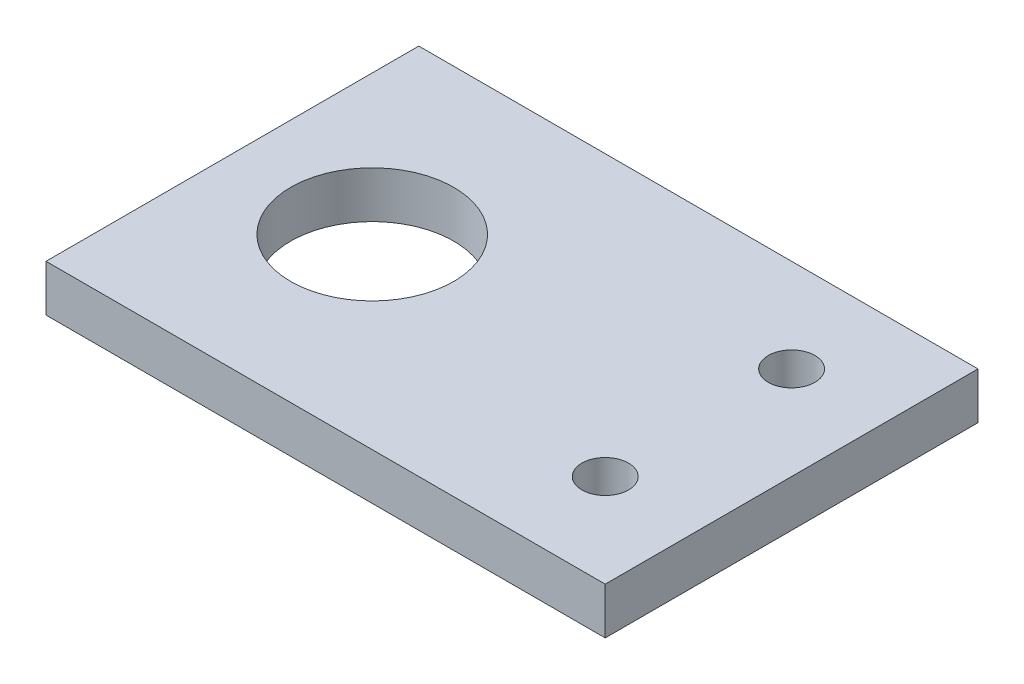
ISO-10303-21;
HEADER;
FILE_DESCRIPTION(('STEP AP214'),'2;1');
FILE_NAME('part.step','',(''),(''),'','','');
FILE_SCHEMA(('AUTOMOTIVE_DESIGN { 1 0 10303 214 1 1 1 1 }'));
ENDSEC;
DATA;
#1=APPLICATION_CONTEXT('core data for automotive mechanical design processes');
#2=APPLICATION_PROTOCOL_DEFINITION('international standard','automotive_design',2000,#1);
#3=PRODUCT_CONTEXT('',#1,'mechanical');
#4=PRODUCT('Part','Part','',(#3));
#5=PRODUCT_RELATED_PRODUCT_CATEGORY('part','',(#4));
#6=PRODUCT_DEFINITION_FORMATION('','',#4);
#7=PRODUCT_DEFINITION_CONTEXT('part definition',#1,'design');
#8=PRODUCT_DEFINITION('design','',#6,#7);
#9=PRODUCT_DEFINITION_SHAPE('','',#8);
#10=(LENGTH_UNIT() NAMED_UNIT(*) SI_UNIT(.MILLI.,.METRE.));
#11=(NAMED_UNIT(*) PLANE_ANGLE_UNIT() SI_UNIT($,.RADIAN.));
#12=(NAMED_UNIT(*) SI_UNIT($,.STERADIAN.) SOLID_ANGLE_UNIT());
#13=UNCERTAINTY_MEASURE_WITH_UNIT(LENGTH_MEASURE(1.E-05),#10,'distance_accuracy_value','');
#14=(GEOMETRIC_REPRESENTATION_CONTEXT(3) GLOBAL_UNCERTAINTY_ASSIGNED_CONTEXT((#13)) GLOBAL_UNIT_ASSIGNED_CONTEXT((#10,
#11,#12)) REPRESENTATION_CONTEXT('',''));
#15=CARTESIAN_POINT('',(0.,0.,0.));
#16=DIRECTION('',(0.,0.,1.));
#17=DIRECTION('',(1.,0.,0.));
#18=AXIS2_PLACEMENT_3D('',#15,#16,#17);
#19=CARTESIAN_POINT('',(-102.768344581676,6.35,-59.1510673494327));
#20=DIRECTION('',(-1.,0.,0.));
#21=DIRECTION('',(0.,0.,1.));
#22=AXIS2_PLACEMENT_3D('',#19,#20,#21);
#23=PLANE('',#22);
#24=DIRECTION('',(0.,0.,-1.));
#25=VECTOR('',#24,1.);
#26=CARTESIAN_POINT('',(-102.768344581676,0.,-59.1510673494327));
#27=LINE('',#26,#25);
#28=CARTESIAN_POINT('',(-102.768344581676,0.,-8.35106734943265));
#29=VERTEX_POINT('',#28);
#30=CARTESIAN_POINT('',(-102.768344581676,0.,-59.1510673494327));
#31=VERTEX_POINT('',#30);
#32=EDGE_CURVE('E96',#29,#31,#27,.T.);
#33=ORIENTED_EDGE('',*,*,#32,.T.);
#34=DIRECTION('',(0.,-1.,0.));
#35=VECTOR('',#34,1.);
#36=CARTESIAN_POINT('',(-102.768344581676,6.35,-59.1510673494327));
#37=LINE('',#36,#35);
#38=CARTESIAN_POINT('',(-102.768344581676,6.35,-59.1510673494327));
#39=VERTEX_POINT('',#38);
#40=EDGE_CURVE('E11',#39,#31,#37,.T.);
#41=ORIENTED_EDGE('',*,*,#40,.F.);
#42=DIRECTION('',(0.,0.,-1.));
#43=VECTOR('',#42,1.);
#44=CARTESIAN_POINT('',(-102.768344581676,6.35,-59.1510673494327));
#45=LINE('',#44,#43);
#46=CARTESIAN_POINT('',(-102.768344581676,6.35,-8.35106734943265));
#47=VERTEX_POINT('',#46);
#48=EDGE_CURVE('E84',#47,#39,#45,.T.);
#49=ORIENTED_EDGE('',*,*,#48,.F.);
#50=DIRECTION('',(0.,-1.,0.));
#51=VECTOR('',#50,1.);
#52=CARTESIAN_POINT('',(-102.768344581676,6.35,-8.35106734943265));
#53=LINE('',#52,#51);
#54=EDGE_CURVE('E92',#47,#29,#53,.T.);
#55=ORIENTED_EDGE('',*,*,#54,.T.);
#56=EDGE_LOOP('',(#33,#41,#49,#55));
#57=FACE_BOUND('',#56,.T.);
#58=ADVANCED_FACE('F33',(#57),#23,.F.);
#59=CARTESIAN_POINT('',(-178.968344581676,6.35,-59.1510673494327));
#60=DIRECTION('',(0.,0.,1.));
#61=DIRECTION('',(1.,0.,0.));
#62=AXIS2_PLACEMENT_3D('',#59,#60,#61);
#63=PLANE('',#62);
#64=DIRECTION('',(-1.,0.,0.));
#65=VECTOR('',#64,1.);
#66=CARTESIAN_POINT('',(-178.968344581676,0.,-59.1510673494327));
#67=LINE('',#66,#65);
#68=CARTESIAN_POINT('',(-178.968344581676,0.,-59.1510673494327));
#69=VERTEX_POINT('',#68);
#70=EDGE_CURVE('E88',#31,#69,#67,.T.);
#71=ORIENTED_EDGE('',*,*,#70,.T.);
#72=DIRECTION('',(0.,-1.,0.));
#73=VECTOR('',#72,1.);
#74=CARTESIAN_POINT('',(-178.968344581676,6.35,-59.1510673494327));
#75=LINE('',#74,#73);
#76=CARTESIAN_POINT('',(-178.968344581676,6.35,-59.1510673494327));
#77=VERTEX_POINT('',#76);
#78=EDGE_CURVE('E41',#77,#69,#75,.T.);
#79=ORIENTED_EDGE('',*,*,#78,.F.);
#80=DIRECTION('',(-1.,0.,0.));
#81=VECTOR('',#80,1.);
#82=CARTESIAN_POINT('',(-178.968344581676,6.35,-59.1510673494327));
#83=LINE('',#82,#81);
#84=EDGE_CURVE('E79',#39,#77,#83,.T.);
#85=ORIENTED_EDGE('',*,*,#84,.F.);
#86=ORIENTED_EDGE('',*,*,#40,.T.);
#87=EDGE_LOOP('',(#71,#79,#85,#86));
#88=FACE_BOUND('',#87,.T.);
#89=ADVANCED_FACE('F87',(#88),#63,.F.);
#90=CARTESIAN_POINT('',(-178.968344581676,6.35,-59.1510673494327));
#91=DIRECTION('',(1.,0.,0.));
#92=DIRECTION('',(0.,0.,-1.));
#93=AXIS2_PLACEMENT_3D('',#90,#91,#92);
#94=PLANE('',#93);
#95=DIRECTION('',(0.,0.,1.));
#96=VECTOR('',#95,1.);
#97=CARTESIAN_POINT('',(-178.968344581676,0.,-59.1510673494327));
#98=LINE('',#97,#96);
#99=CARTESIAN_POINT('',(-178.968344581676,0.,-8.35106734943265));
#100=VERTEX_POINT('',#99);
#101=EDGE_CURVE('E66',#69,#100,#98,.T.);
#102=ORIENTED_EDGE('',*,*,#101,.T.);
#103=DIRECTION('',(0.,-1.,0.));
#104=VECTOR('',#103,1.);
#105=CARTESIAN_POINT('',(-178.968344581676,6.35,-8.35106734943265));
#106=LINE('',#105,#104);
#107=CARTESIAN_POINT('',(-178.968344581676,6.35,-8.35106734943265));
#108=VERTEX_POINT('',#107);
#109=EDGE_CURVE('E89',#108,#100,#106,.T.);
#110=ORIENTED_EDGE('',*,*,#109,.F.);
#111=DIRECTION('',(0.,0.,1.));
#112=VECTOR('',#111,1.);
#113=CARTESIAN_POINT('',(-178.968344581676,6.35,-59.1510673494327));
#114=LINE('',#113,#112);
#115=EDGE_CURVE('E82',#77,#108,#114,.T.);
#116=ORIENTED_EDGE('',*,*,#115,.F.);
#117=ORIENTED_EDGE('',*,*,#78,.T.);
#118=EDGE_LOOP('',(#102,#110,#116,#117));
#119=FACE_BOUND('',#118,.T.);
#120=ADVANCED_FACE('F90',(#119),#94,.F.);
#121=CARTESIAN_POINT('',(-178.968344581676,6.35,-8.35106734943265));
#122=DIRECTION('',(0.,0.,-1.));
#123=DIRECTION('',(-1.,0.,0.));
#124=AXIS2_PLACEMENT_3D('',#121,#122,#123);
#125=PLANE('',#124);
#126=DIRECTION('',(1.,0.,0.));
#127=VECTOR('',#126,1.);
#128=CARTESIAN_POINT('',(-178.968344581676,0.,-8.35106734943265));
#129=LINE('',#128,#127);
#130=EDGE_CURVE('E72',#100,#29,#129,.T.);
#131=ORIENTED_EDGE('',*,*,#130,.T.);
#132=ORIENTED_EDGE('',*,*,#54,.F.);
#133=DIRECTION('',(1.,0.,0.));
#134=VECTOR('',#133,1.);
#135=CARTESIAN_POINT('',(-178.968344581676,6.35,-8.35106734943265));
#136=LINE('',#135,#134);
#137=EDGE_CURVE('E49',#108,#47,#136,.T.);
#138=ORIENTED_EDGE('',*,*,#137,.F.);
#139=ORIENTED_EDGE('',*,*,#109,.T.);
#140=EDGE_LOOP('',(#131,#132,#138,#139));
#141=FACE_BOUND('',#140,.T.);
#142=ADVANCED_FACE('F104',(#141),#125,.F.);
#143=CARTESIAN_POINT('',(0.,6.35,0.));
#144=DIRECTION('',(0.,1.,0.));
#145=DIRECTION('',(0.,0.,1.));
#146=AXIS2_PLACEMENT_3D('',#143,#144,#145);
#147=PLANE('',#146);
#148=CARTESIAN_POINT('',(-115.468344581676,6.35,-21.0510673494327));
#149=DIRECTION('',(0.,1.,0.));
#150=DIRECTION('',(0.,0.,1.));
#151=AXIS2_PLACEMENT_3D('',#148,#149,#150);
#152=CIRCLE('',#151,3.175);
#153=CARTESIAN_POINT('',(-115.468344581676,6.35,-17.8760673494327));
#154=VERTEX_POINT('',#153);
#155=EDGE_CURVE('E122',#154,#154,#152,.T.);
#156=ORIENTED_EDGE('',*,*,#155,.F.);
#157=EDGE_LOOP('',(#156));
#158=FACE_BOUND('',#157,.T.);
#159=CARTESIAN_POINT('',(-115.468344581676,6.35,-46.4510673494326));
#160=DIRECTION('',(0.,1.,0.));
#161=DIRECTION('',(0.,0.,1.));
#162=AXIS2_PLACEMENT_3D('',#159,#160,#161);
#163=CIRCLE('',#162,3.175);
#164=CARTESIAN_POINT('',(-115.468344581676,6.35,-43.2760673494327));
#165=VERTEX_POINT('',#164);
#166=EDGE_CURVE('E116',#165,#165,#163,.T.);
#167=ORIENTED_EDGE('',*,*,#166,.F.);
#168=EDGE_LOOP('',(#167));
#169=FACE_BOUND('',#168,.T.);
#170=CARTESIAN_POINT('',(-159.918344581676,6.35,-33.7510673494327));
#171=DIRECTION('',(0.,1.,0.));
#172=DIRECTION('',(0.,0.,1.));
#173=AXIS2_PLACEMENT_3D('',#170,#171,#172);
#174=CIRCLE('',#173,11.1125);
#175=CARTESIAN_POINT('',(-159.918344581676,6.35,-22.6385673494326));
#176=VERTEX_POINT('',#175);
#177=EDGE_CURVE('E110',#176,#176,#174,.T.);
#178=ORIENTED_EDGE('',*,*,#177,.F.);
#179=EDGE_LOOP('',(#178));
#180=FACE_BOUND('',#179,.T.);
#181=ORIENTED_EDGE('',*,*,#48,.T.);
#182=ORIENTED_EDGE('',*,*,#84,.T.);
#183=ORIENTED_EDGE('',*,*,#115,.T.);
#184=ORIENTED_EDGE('',*,*,#137,.T.);
#185=EDGE_LOOP('',(#181,#182,#183,#184));
#186=FACE_BOUND('',#185,.T.);
#187=ADVANCED_FACE('F80',(#158,#169,#180,#186),#147,.T.);
#188=CARTESIAN_POINT('',(0.,0.,0.));
#189=DIRECTION('',(0.,1.,0.));
#190=DIRECTION('',(0.,0.,1.));
#191=AXIS2_PLACEMENT_3D('',#188,#189,#190);
#192=PLANE('',#191);
#193=CARTESIAN_POINT('',(-115.468344581676,0.,-21.0510673494327));
#194=DIRECTION('',(0.,1.,0.));
#195=DIRECTION('',(0.,0.,1.));
#196=AXIS2_PLACEMENT_3D('',#193,#194,#195);
#197=CIRCLE('',#196,3.175);
#198=CARTESIAN_POINT('',(-115.468344581676,0.,-17.8760673494327));
#199=VERTEX_POINT('',#198);
#200=EDGE_CURVE('E119',#199,#199,#197,.T.);
#201=ORIENTED_EDGE('',*,*,#200,.T.);
#202=EDGE_LOOP('',(#201));
#203=FACE_BOUND('',#202,.T.);
#204=CARTESIAN_POINT('',(-115.468344581676,0.,-46.4510673494326));
#205=DIRECTION('',(0.,1.,0.));
#206=DIRECTION('',(0.,0.,1.));
#207=AXIS2_PLACEMENT_3D('',#204,#205,#206);
#208=CIRCLE('',#207,3.175);
#209=CARTESIAN_POINT('',(-115.468344581676,0.,-43.2760673494327));
#210=VERTEX_POINT('',#209);
#211=EDGE_CURVE('E113',#210,#210,#208,.T.);
#212=ORIENTED_EDGE('',*,*,#211,.T.);
#213=EDGE_LOOP('',(#212));
#214=FACE_BOUND('',#213,.T.);
#215=CARTESIAN_POINT('',(-159.918344581676,0.,-33.7510673494327));
#216=DIRECTION('',(0.,1.,0.));
#217=DIRECTION('',(0.,0.,1.));
#218=AXIS2_PLACEMENT_3D('',#215,#216,#217);
#219=CIRCLE('',#218,11.1125);
#220=CARTESIAN_POINT('',(-159.918344581676,0.,-22.6385673494326));
#221=VERTEX_POINT('',#220);
#222=EDGE_CURVE('E99',#221,#221,#219,.T.);
#223=ORIENTED_EDGE('',*,*,#222,.T.);
#224=EDGE_LOOP('',(#223));
#225=FACE_BOUND('',#224,.T.);
#226=ORIENTED_EDGE('',*,*,#32,.F.);
#227=ORIENTED_EDGE('',*,*,#130,.F.);
#228=ORIENTED_EDGE('',*,*,#101,.F.);
#229=ORIENTED_EDGE('',*,*,#70,.F.);
#230=EDGE_LOOP('',(#226,#227,#228,#229));
#231=FACE_BOUND('',#230,.T.);
#232=ADVANCED_FACE('F107',(#203,#214,#225,#231),#192,.F.);
#233=CARTESIAN_POINT('',(-159.918344581676,0.,-33.7510673494327));
#234=DIRECTION('',(0.,1.,0.));
#235=DIRECTION('',(0.,0.,1.));
#236=AXIS2_PLACEMENT_3D('',#233,#234,#235);
#237=CYLINDRICAL_SURFACE('',#236,11.1125);
#238=ORIENTED_EDGE('',*,*,#222,.F.);
#239=EDGE_LOOP('',(#238));
#240=FACE_BOUND('',#239,.T.);
#241=ORIENTED_EDGE('',*,*,#177,.T.);
#242=EDGE_LOOP('',(#241));
#243=FACE_BOUND('',#242,.T.);
#244=ADVANCED_FACE('F144',(#240,#243),#237,.F.);
#245=CARTESIAN_POINT('',(-115.468344581676,0.,-46.4510673494326));
#246=DIRECTION('',(0.,1.,0.));
#247=DIRECTION('',(0.,0.,1.));
#248=AXIS2_PLACEMENT_3D('',#245,#246,#247);
#249=CYLINDRICAL_SURFACE('',#248,3.175);
#250=ORIENTED_EDGE('',*,*,#211,.F.);
#251=EDGE_LOOP('',(#250));
#252=FACE_BOUND('',#251,.T.);
#253=ORIENTED_EDGE('',*,*,#166,.T.);
#254=EDGE_LOOP('',(#253));
#255=FACE_BOUND('',#254,.T.);
#256=ADVANCED_FACE('F133',(#252,#255),#249,.F.);
#257=CARTESIAN_POINT('',(-115.468344581676,0.,-21.0510673494327));
#258=DIRECTION('',(0.,1.,0.));
#259=DIRECTION('',(0.,0.,1.));
#260=AXIS2_PLACEMENT_3D('',#257,#258,#259);
#261=CYLINDRICAL_SURFACE('',#260,3.175);
#262=ORIENTED_EDGE('',*,*,#200,.F.);
#263=EDGE_LOOP('',(#262));
#264=FACE_BOUND('',#263,.T.);
#265=ORIENTED_EDGE('',*,*,#155,.T.);
#266=EDGE_LOOP('',(#265));
#267=FACE_BOUND('',#266,.T.);
#268=ADVANCED_FACE('F130',(#264,#267),#261,.F.);
#269=CLOSED_SHELL('',(#58,#89,#120,#142,#187,#232,#244,#256,#268));
#270=MANIFOLD_SOLID_BREP('B2',#269);
#271=ADVANCED_BREP_SHAPE_REPRESENTATION('',(#18,#270),#14);
#272=SHAPE_DEFINITION_REPRESENTATION(#9,#271);
ENDSEC;
END-ISO-10303-21;
